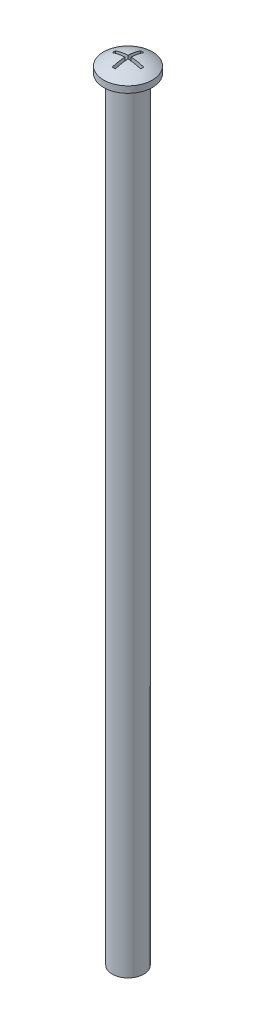
ISO-10303-21;
HEADER;
FILE_DESCRIPTION(('STEP AP214'),'2;1');
FILE_NAME('part.step','',(''),(''),'','','');
FILE_SCHEMA(('AUTOMOTIVE_DESIGN { 1 0 10303 214 1 1 1 1 }'));
ENDSEC;
DATA;
#1=APPLICATION_CONTEXT('core data for automotive mechanical design processes');
#2=APPLICATION_PROTOCOL_DEFINITION('international standard','automotive_design',2000,#1);
#3=PRODUCT_CONTEXT('',#1,'mechanical');
#4=PRODUCT('Part','Part','',(#3));
#5=PRODUCT_RELATED_PRODUCT_CATEGORY('part','',(#4));
#6=PRODUCT_DEFINITION_FORMATION('','',#4);
#7=PRODUCT_DEFINITION_CONTEXT('part definition',#1,'design');
#8=PRODUCT_DEFINITION('design','',#6,#7);
#9=PRODUCT_DEFINITION_SHAPE('','',#8);
#10=(LENGTH_UNIT() NAMED_UNIT(*) SI_UNIT(.MILLI.,.METRE.));
#11=(NAMED_UNIT(*) PLANE_ANGLE_UNIT() SI_UNIT($,.RADIAN.));
#12=(NAMED_UNIT(*) SI_UNIT($,.STERADIAN.) SOLID_ANGLE_UNIT());
#13=UNCERTAINTY_MEASURE_WITH_UNIT(LENGTH_MEASURE(1.E-05),#10,'distance_accuracy_value','');
#14=(GEOMETRIC_REPRESENTATION_CONTEXT(3) GLOBAL_UNCERTAINTY_ASSIGNED_CONTEXT((#13)) GLOBAL_UNIT_ASSIGNED_CONTEXT((#10,
#11,#12)) REPRESENTATION_CONTEXT('',''));
#15=CARTESIAN_POINT('',(0.,0.,0.));
#16=DIRECTION('',(0.,0.,1.));
#17=DIRECTION('',(1.,0.,0.));
#18=AXIS2_PLACEMENT_3D('',#15,#16,#17);
#19=CARTESIAN_POINT('',(0.,35.8974187788306,0.));
#20=CARTESIAN_POINT('',(-0.86080008171223,35.8959880970202,0.));
#21=CARTESIAN_POINT('',(-1.55,35.4115299673482,0.));
#22=B_SPLINE_CURVE_WITH_KNOTS('',2,(#19,#20,#21),.UNSPECIFIED.,.F.,.F.,(3,3),(0.,1.),.UNSPECIFIED.);
#23=CARTESIAN_POINT('',(0.,0.,0.));
#24=DIRECTION('',(0.,-1.,0.));
#25=AXIS1_PLACEMENT('',#23,#24);
#26=SURFACE_OF_REVOLUTION('',#22,#25);
#27=CARTESIAN_POINT('',(-0.1,35.7460206438407,-0.9));
#28=CARTESIAN_POINT('',(-0.0666666666666666,35.7473207457581,-0.9));
#29=CARTESIAN_POINT('',(-0.0333333333333332,35.7479707967168,-0.9));
#30=CARTESIAN_POINT('',(0.0333333333333336,35.7479707967168,-0.9));
#31=CARTESIAN_POINT('',(0.066666666666667,35.7473207457581,-0.9));
#32=CARTESIAN_POINT('',(0.1,35.7460206438407,-0.9));
#33=B_SPLINE_CURVE_WITH_KNOTS('',3,(#27,#28,#29,#30,#31,#32),.UNSPECIFIED.,.F.,.F.,(4,2,4),(0.,
0.100019013673602,0.200038027347205),.UNSPECIFIED.);
#34=CARTESIAN_POINT('',(-0.1,35.7460206438406,-0.9));
#35=VERTEX_POINT('',#34);
#36=CARTESIAN_POINT('',(0.1,35.7460206438406,-0.9));
#37=VERTEX_POINT('',#36);
#38=EDGE_CURVE('E53',#35,#37,#33,.T.);
#39=ORIENTED_EDGE('',*,*,#38,.T.);
#40=CARTESIAN_POINT('',(0.1,35.7460206438407,-0.9));
#41=CARTESIAN_POINT('',(0.1,35.7603650964249,-0.859165155971421));
#42=CARTESIAN_POINT('',(0.1,35.7736707218079,-0.817975380802403));
#43=CARTESIAN_POINT('',(0.1,35.7981960042845,-0.734980187538004));
#44=CARTESIAN_POINT('',(0.1,35.8094157043373,-0.693174782140508));
#45=CARTESIAN_POINT('',(0.0999999999999999,35.8397819917709,-0.567603593500357));
#46=CARTESIAN_POINT('',(0.0999999999999997,35.8558504893188,-0.483068742429389));
#47=CARTESIAN_POINT('',(0.0999999999999998,35.8748623212978,-0.348710392706932));
#48=CARTESIAN_POINT('',(0.0999999999999999,35.8804835266519,-0.299240524949403));
#49=CARTESIAN_POINT('',(0.1,35.8891250606415,-0.199864425522463));
#50=CARTESIAN_POINT('',(0.1,35.8921343946752,-0.149957234000707));
#51=CARTESIAN_POINT('',(0.1,35.893867884993,-0.0999999999999991));
#52=B_SPLINE_CURVE_WITH_KNOTS('',3,(#40,#41,#42,#43,#44,#45,#46,#47,#48,#49,#50,#51),
.UNSPECIFIED.,.F.,.F.,(4,2,2,2,2,4),(0.,0.129810934123178,0.259619194528052,0.517292623754669,
0.666598222884649,0.816529313343596),.UNSPECIFIED.);
#53=CARTESIAN_POINT('',(0.1,35.893867884993,-0.0999999999999998));
#54=VERTEX_POINT('',#53);
#55=EDGE_CURVE('E11',#37,#54,#52,.T.);
#56=ORIENTED_EDGE('',*,*,#55,.T.);
#57=CARTESIAN_POINT('',(0.0999999999999999,35.893867884993,-0.0999999999999998));
#58=CARTESIAN_POINT('',(0.109355285379155,35.8935439200009,-0.0999999999999997));
#59=CARTESIAN_POINT('',(0.118709056510519,35.8931750152553,-0.0999999999999997));
#60=CARTESIAN_POINT('',(0.165474926146777,35.8911041724258,-0.0999999999999997));
#61=CARTESIAN_POINT('',(0.202858048316559,35.8887239050631,-0.0999999999999997));
#62=CARTESIAN_POINT('',(0.315133594740093,35.8793365965761,-0.0999999999999998));
#63=CARTESIAN_POINT('',(0.389851384662339,35.8700842731403,-0.0999999999999998));
#64=CARTESIAN_POINT('',(0.53827131499717,35.8453396870849,-0.0999999999999997));
#65=CARTESIAN_POINT('',(0.611973271314862,35.8298463084133,-0.0999999999999997));
#66=CARTESIAN_POINT('',(0.721170542553564,35.8018911789562,-0.0999999999999997));
#67=CARTESIAN_POINT('',(0.757287143973613,35.7918067846708,-0.0999999999999997));
#68=CARTESIAN_POINT('',(0.82902501472042,35.7700803412918,-0.0999999999999998));
#69=CARTESIAN_POINT('',(0.864646568163323,35.7584392301397,-0.0999999999999998));
#70=CARTESIAN_POINT('',(0.899999999999999,35.7460206438406,-0.0999999999999998));
#71=B_SPLINE_CURVE_WITH_KNOTS('',3,(#57,#58,#59,#60,#61,#62,#63,#64,#65,#66,#67,#68,#69,#70),
.UNSPECIFIED.,.F.,.F.,(4,2,2,2,2,2,4),(0.,0.0280827228415932,0.140433640862802,
0.366035371056075,0.59167746222928,0.704140234262215,0.816535548819868),.UNSPECIFIED.);
#72=CARTESIAN_POINT('',(0.9,35.7460206438407,-0.0999999999999997));
#73=VERTEX_POINT('',#72);
#74=EDGE_CURVE('E135',#54,#73,#71,.T.);
#75=ORIENTED_EDGE('',*,*,#74,.T.);
#76=CARTESIAN_POINT('',(0.9,35.7460206438407,-0.0999999999999997));
#77=CARTESIAN_POINT('',(0.9,35.7473207457581,-0.0666666666666663));
#78=CARTESIAN_POINT('',(0.9,35.7479707967168,-0.033333333333333));
#79=CARTESIAN_POINT('',(0.9,35.7479707967168,0.0333333333333336));
#80=CARTESIAN_POINT('',(0.9,35.7473207457581,0.0666666666666669));
#81=CARTESIAN_POINT('',(0.9,35.7460206438406,0.1));
#82=B_SPLINE_CURVE_WITH_KNOTS('',3,(#76,#77,#78,#79,#80,#81),.UNSPECIFIED.,.F.,.F.,(4,2,4),(0.,
0.100019013673602,0.200038027347204),.UNSPECIFIED.);
#83=CARTESIAN_POINT('',(0.9,35.7460206438406,0.1));
#84=VERTEX_POINT('',#83);
#85=EDGE_CURVE('E224',#73,#84,#82,.T.);
#86=ORIENTED_EDGE('',*,*,#85,.T.);
#87=CARTESIAN_POINT('',(0.9,35.7460206438406,0.1));
#88=CARTESIAN_POINT('',(0.859165155971422,35.7603650964249,0.1));
#89=CARTESIAN_POINT('',(0.817975380802403,35.7736707218079,0.1));
#90=CARTESIAN_POINT('',(0.734980187538005,35.7981960042845,0.1));
#91=CARTESIAN_POINT('',(0.693174782140509,35.8094157043373,0.1));
#92=CARTESIAN_POINT('',(0.567603593500359,35.8397819917709,0.1));
#93=CARTESIAN_POINT('',(0.483068742429389,35.8558504893188,0.1));
#94=CARTESIAN_POINT('',(0.348710392706932,35.8748623212978,0.1));
#95=CARTESIAN_POINT('',(0.299240524949403,35.8804835266519,0.1));
#96=CARTESIAN_POINT('',(0.199864425522463,35.8891250606415,0.1));
#97=CARTESIAN_POINT('',(0.149957234000707,35.8921343946752,0.1));
#98=CARTESIAN_POINT('',(0.0999999999999989,35.893867884993,0.1));
#99=B_SPLINE_CURVE_WITH_KNOTS('',3,(#87,#88,#89,#90,#91,#92,#93,#94,#95,#96,#97,#98),
.UNSPECIFIED.,.F.,.F.,(4,2,2,2,2,4),(0.,0.12981093412318,0.259619194528053,0.51729262375467,
0.66659822288465,0.816529313343598),.UNSPECIFIED.);
#100=CARTESIAN_POINT('',(0.1,35.893867884993,0.1));
#101=VERTEX_POINT('',#100);
#102=EDGE_CURVE('E355',#84,#101,#99,.T.);
#103=ORIENTED_EDGE('',*,*,#102,.T.);
#104=CARTESIAN_POINT('',(0.0999999999999999,35.893867884993,0.1));
#105=CARTESIAN_POINT('',(0.1,35.8935439200009,0.109355285379155));
#106=CARTESIAN_POINT('',(0.1,35.8931750152553,0.118709056510519));
#107=CARTESIAN_POINT('',(0.1,35.8911041724257,0.165474926146776));
#108=CARTESIAN_POINT('',(0.1,35.8887239050631,0.20285804831656));
#109=CARTESIAN_POINT('',(0.0999999999999999,35.8793365965762,0.315133594740094));
#110=CARTESIAN_POINT('',(0.0999999999999999,35.8700842731403,0.389851384662338));
#111=CARTESIAN_POINT('',(0.1,35.8453396870849,0.538271314997169));
#112=CARTESIAN_POINT('',(0.1,35.8298463084133,0.611973271314862));
#113=CARTESIAN_POINT('',(0.0999999999999999,35.8018911789562,0.721170542553566));
#114=CARTESIAN_POINT('',(0.0999999999999999,35.7918067846708,0.757287143973614));
#115=CARTESIAN_POINT('',(0.1,35.7700803412918,0.829025014720422));
#116=CARTESIAN_POINT('',(0.1,35.7584392301397,0.864646568163323));
#117=CARTESIAN_POINT('',(0.1,35.7460206438406,0.899999999999999));
#118=B_SPLINE_CURVE_WITH_KNOTS('',3,(#104,#105,#106,#107,#108,#109,#110,#111,#112,#113,#114,
#115,#116,#117),.UNSPECIFIED.,.F.,.F.,(4,2,2,2,2,2,4),(0.,0.0280827228415933,0.140433640862801,
0.366035371056074,0.591677462229281,0.704140234262217,0.816535548819868),.UNSPECIFIED.);
#119=CARTESIAN_POINT('',(0.1,35.7460206438407,0.9));
#120=VERTEX_POINT('',#119);
#121=EDGE_CURVE('E349',#101,#120,#118,.T.);
#122=ORIENTED_EDGE('',*,*,#121,.T.);
#123=CARTESIAN_POINT('',(0.0999999999999999,35.7460206438407,0.9));
#124=CARTESIAN_POINT('',(0.0666666666666665,35.7473207457581,0.9));
#125=CARTESIAN_POINT('',(0.0333333333333332,35.7479707967168,0.9));
#126=CARTESIAN_POINT('',(-0.0333333333333335,35.7479707967168,0.9));
#127=CARTESIAN_POINT('',(-0.0666666666666668,35.7473207457581,0.9));
#128=CARTESIAN_POINT('',(-0.1,35.7460206438406,0.9));
#129=B_SPLINE_CURVE_WITH_KNOTS('',3,(#123,#124,#125,#126,#127,#128),.UNSPECIFIED.,.F.,.F.,(4,2,
4),(0.,0.100019013673602,0.200038027347204),.UNSPECIFIED.);
#130=CARTESIAN_POINT('',(-0.1,35.7460206438406,0.9));
#131=VERTEX_POINT('',#130);
#132=EDGE_CURVE('E342',#120,#131,#129,.T.);
#133=ORIENTED_EDGE('',*,*,#132,.T.);
#134=CARTESIAN_POINT('',(-0.1,35.7460206438406,0.9));
#135=CARTESIAN_POINT('',(-0.1,35.7603650964249,0.859165155971423));
#136=CARTESIAN_POINT('',(-0.1,35.7736707218079,0.817975380802407));
#137=CARTESIAN_POINT('',(-0.1,35.7981960042845,0.734980187538016));
#138=CARTESIAN_POINT('',(-0.1,35.8094157043373,0.693174782140524));
#139=CARTESIAN_POINT('',(-0.1,35.8397819917709,0.567603593500385));
#140=CARTESIAN_POINT('',(-0.1,35.8558504893188,0.483068742429421));
#141=CARTESIAN_POINT('',(-0.1,35.8748623212978,0.348710392706963));
#142=CARTESIAN_POINT('',(-0.1,35.8804835266519,0.299240524949429));
#143=CARTESIAN_POINT('',(-0.1,35.8891250606415,0.199864425522478));
#144=CARTESIAN_POINT('',(-0.1,35.8921343946752,0.149957234000716));
#145=CARTESIAN_POINT('',(-0.1,35.893867884993,0.100000000000003));
#146=B_SPLINE_CURVE_WITH_KNOTS('',3,(#134,#135,#136,#137,#138,#139,#140,#141,#142,#143,#144,
#145),.UNSPECIFIED.,.F.,.F.,(4,2,2,2,2,4),(0.,0.129810934123171,0.259619194528035,
0.517292623754634,0.66659822288463,0.816529313343594),.UNSPECIFIED.);
#147=CARTESIAN_POINT('',(-0.1,35.893867884993,0.1));
#148=VERTEX_POINT('',#147);
#149=EDGE_CURVE('E319',#131,#148,#146,.T.);
#150=ORIENTED_EDGE('',*,*,#149,.T.);
#151=CARTESIAN_POINT('',(-0.1,35.893867884993,0.1));
#152=CARTESIAN_POINT('',(-0.109355285379155,35.8935439200009,0.1));
#153=CARTESIAN_POINT('',(-0.118709056510518,35.8931750152552,0.1));
#154=CARTESIAN_POINT('',(-0.165474926146776,35.8911041724257,0.1));
#155=CARTESIAN_POINT('',(-0.202858048316559,35.8887239050631,0.1));
#156=CARTESIAN_POINT('',(-0.315133594740094,35.8793365965762,0.1));
#157=CARTESIAN_POINT('',(-0.389851384662337,35.8700842731403,0.1));
#158=CARTESIAN_POINT('',(-0.538271314997168,35.8453396870849,0.1));
#159=CARTESIAN_POINT('',(-0.611973271314863,35.8298463084133,0.100000000000001));
#160=CARTESIAN_POINT('',(-0.721170542553566,35.8018911789562,0.1));
#161=CARTESIAN_POINT('',(-0.757287143973615,35.7918067846708,0.1));
#162=CARTESIAN_POINT('',(-0.829025014720422,35.7700803412918,0.1));
#163=CARTESIAN_POINT('',(-0.864646568163323,35.7584392301396,0.1));
#164=CARTESIAN_POINT('',(-0.900000000000001,35.7460206438406,0.100000000000001));
#165=B_SPLINE_CURVE_WITH_KNOTS('',3,(#151,#152,#153,#154,#155,#156,#157,#158,#159,#160,#161,
#162,#163,#164),.UNSPECIFIED.,.F.,.F.,(4,2,2,2,2,2,4),(0.,0.0280827228415936,0.140433640862802,
0.366035371056073,0.591677462229281,0.70414023426222,0.816535548819869),.UNSPECIFIED.);
#166=CARTESIAN_POINT('',(-0.9,35.7460206438406,0.1));
#167=VERTEX_POINT('',#166);
#168=EDGE_CURVE('E312',#148,#167,#165,.T.);
#169=ORIENTED_EDGE('',*,*,#168,.T.);
#170=CARTESIAN_POINT('',(-0.9,35.7460206438406,0.1));
#171=CARTESIAN_POINT('',(-0.9,35.7473207457581,0.066666666666667));
#172=CARTESIAN_POINT('',(-0.9,35.7479707967168,0.0333333333333336));
#173=CARTESIAN_POINT('',(-0.9,35.7479707967168,-0.0333333333333333));
#174=CARTESIAN_POINT('',(-0.9,35.7473207457581,-0.0666666666666667));
#175=CARTESIAN_POINT('',(-0.9,35.7460206438407,-0.1));
#176=B_SPLINE_CURVE_WITH_KNOTS('',3,(#170,#171,#172,#173,#174,#175),.UNSPECIFIED.,.F.,.F.,(4,2,
4),(0.,0.100019013673602,0.200038027347205),.UNSPECIFIED.);
#177=CARTESIAN_POINT('',(-0.9,35.7460206438406,-0.0999999999999998));
#178=VERTEX_POINT('',#177);
#179=EDGE_CURVE('E305',#167,#178,#176,.T.);
#180=ORIENTED_EDGE('',*,*,#179,.T.);
#181=CARTESIAN_POINT('',(-0.9,35.7460206438406,-0.0999999999999999));
#182=CARTESIAN_POINT('',(-0.859165155971419,35.7603650964249,-0.0999999999999998));
#183=CARTESIAN_POINT('',(-0.8179753808024,35.7736707218079,-0.0999999999999998));
#184=CARTESIAN_POINT('',(-0.734980187538004,35.7981960042845,-0.0999999999999998));
#185=CARTESIAN_POINT('',(-0.693174782140509,35.8094157043373,-0.0999999999999998));
#186=CARTESIAN_POINT('',(-0.567603593500361,35.8397819917709,-0.0999999999999998));
#187=CARTESIAN_POINT('',(-0.48306874242939,35.8558504893188,-0.0999999999999997));
#188=CARTESIAN_POINT('',(-0.348710392706932,35.8748623212978,-0.0999999999999997));
#189=CARTESIAN_POINT('',(-0.299240524949403,35.8804835266519,-0.0999999999999998));
#190=CARTESIAN_POINT('',(-0.199864425522464,35.8891250606415,-0.0999999999999998));
#191=CARTESIAN_POINT('',(-0.149957234000707,35.8921343946752,-0.0999999999999999));
#192=CARTESIAN_POINT('',(-0.0999999999999993,35.893867884993,-0.0999999999999998));
#193=B_SPLINE_CURVE_WITH_KNOTS('',3,(#181,#182,#183,#184,#185,#186,#187,#188,#189,#190,#191,
#192),.UNSPECIFIED.,.F.,.F.,(4,2,2,2,2,4),(0.,0.12981093412318,0.259619194528054,
0.517292623754671,0.666598222884651,0.816529313343598),.UNSPECIFIED.);
#194=CARTESIAN_POINT('',(-0.1,35.893867884993,-0.0999999999999998));
#195=VERTEX_POINT('',#194);
#196=EDGE_CURVE('E271',#178,#195,#193,.T.);
#197=ORIENTED_EDGE('',*,*,#196,.T.);
#198=CARTESIAN_POINT('',(-0.1,35.893867884993,-0.0999999999999998));
#199=CARTESIAN_POINT('',(-0.1,35.8935439200009,-0.109355285379155));
#200=CARTESIAN_POINT('',(-0.1,35.8931750152553,-0.118709056510518));
#201=CARTESIAN_POINT('',(-0.1,35.8911041724258,-0.165474926146776));
#202=CARTESIAN_POINT('',(-0.1,35.8887239050631,-0.202858048316559));
#203=CARTESIAN_POINT('',(-0.1,35.8793365965761,-0.315133594740092));
#204=CARTESIAN_POINT('',(-0.1,35.8700842731403,-0.389851384662336));
#205=CARTESIAN_POINT('',(-0.1,35.8453396870849,-0.538271314997168));
#206=CARTESIAN_POINT('',(-0.1,35.8298463084133,-0.611973271314863));
#207=CARTESIAN_POINT('',(-0.1,35.8018911789562,-0.721170542553564));
#208=CARTESIAN_POINT('',(-0.1,35.7918067846708,-0.757287143973612));
#209=CARTESIAN_POINT('',(-0.1,35.7700803412918,-0.829025014720419));
#210=CARTESIAN_POINT('',(-0.1,35.7584392301396,-0.864646568163322));
#211=CARTESIAN_POINT('',(-0.1,35.7460206438406,-0.9));
#212=B_SPLINE_CURVE_WITH_KNOTS('',3,(#198,#199,#200,#201,#202,#203,#204,#205,#206,#207,#208,
#209,#210,#211),.UNSPECIFIED.,.F.,.F.,(4,2,2,2,2,2,4),(0.,0.028082722841593,0.140433640862802,
0.366035371056074,0.591677462229278,0.704140234262214,0.816535548819869),.UNSPECIFIED.);
#213=EDGE_CURVE('E268',#195,#35,#212,.T.);
#214=ORIENTED_EDGE('',*,*,#213,.T.);
#215=EDGE_LOOP('',(#39,#56,#75,#86,#103,#122,#133,#150,#169,#180,#197,#214));
#216=FACE_BOUND('',#215,.T.);
#217=CARTESIAN_POINT('',(0.,35.4115299673482,0.));
#218=DIRECTION('',(0.,-1.,0.));
#219=DIRECTION('',(0.,0.,-1.));
#220=AXIS2_PLACEMENT_3D('',#217,#218,#219);
#221=CIRCLE('',#220,1.55);
#222=CARTESIAN_POINT('',(0.,35.4115299673482,-1.55));
#223=VERTEX_POINT('',#222);
#224=EDGE_CURVE('E215',#223,#223,#221,.T.);
#225=ORIENTED_EDGE('',*,*,#224,.F.);
#226=EDGE_LOOP('',(#225));
#227=FACE_BOUND('',#226,.T.);
#228=ADVANCED_FACE('F39',(#216,#227),#26,.T.);
#229=CARTESIAN_POINT('',(0.,0.,0.));
#230=DIRECTION('',(0.,-1.,0.));
#231=DIRECTION('',(0.,0.,-1.));
#232=AXIS2_PLACEMENT_3D('',#229,#230,#231);
#233=CYLINDRICAL_SURFACE('',#232,1.55);
#234=CARTESIAN_POINT('',(0.,35.,0.));
#235=DIRECTION('',(0.,-1.,0.));
#236=DIRECTION('',(0.,0.,-1.));
#237=AXIS2_PLACEMENT_3D('',#234,#235,#236);
#238=CIRCLE('',#237,1.55);
#239=CARTESIAN_POINT('',(0.,35.,-1.55));
#240=VERTEX_POINT('',#239);
#241=EDGE_CURVE('E212',#240,#240,#238,.T.);
#242=ORIENTED_EDGE('',*,*,#241,.F.);
#243=EDGE_LOOP('',(#242));
#244=FACE_BOUND('',#243,.T.);
#245=ORIENTED_EDGE('',*,*,#224,.T.);
#246=EDGE_LOOP('',(#245));
#247=FACE_BOUND('',#246,.T.);
#248=ADVANCED_FACE('F250',(#244,#247),#233,.T.);
#249=CARTESIAN_POINT('',(-1.,35.,0.));
#250=DIRECTION('',(0.,1.,0.));
#251=DIRECTION('',(0.,0.,1.));
#252=AXIS2_PLACEMENT_3D('',#249,#250,#251);
#253=PLANE('',#252);
#254=CARTESIAN_POINT('',(0.,35.,0.));
#255=DIRECTION('',(0.,-1.,0.));
#256=DIRECTION('',(0.,0.,-1.));
#257=AXIS2_PLACEMENT_3D('',#254,#255,#256);
#258=CIRCLE('',#257,1.);
#259=CARTESIAN_POINT('',(0.,35.,-1.));
#260=VERTEX_POINT('',#259);
#261=EDGE_CURVE('E209',#260,#260,#258,.T.);
#262=ORIENTED_EDGE('',*,*,#261,.F.);
#263=EDGE_LOOP('',(#262));
#264=FACE_BOUND('',#263,.T.);
#265=ORIENTED_EDGE('',*,*,#241,.T.);
#266=EDGE_LOOP('',(#265));
#267=FACE_BOUND('',#266,.T.);
#268=ADVANCED_FACE('F247',(#264,#267),#253,.F.);
#269=CARTESIAN_POINT('',(0.,0.,0.));
#270=DIRECTION('',(0.,-1.,0.));
#271=DIRECTION('',(0.,0.,-1.));
#272=AXIS2_PLACEMENT_3D('',#269,#270,#271);
#273=CYLINDRICAL_SURFACE('',#272,1.);
#274=CARTESIAN_POINT('',(0.,-14.000000000005,0.));
#275=DIRECTION('',(0.,-1.,0.));
#276=DIRECTION('',(0.,0.,-1.));
#277=AXIS2_PLACEMENT_3D('',#274,#275,#276);
#278=CIRCLE('',#277,1.);
#279=CARTESIAN_POINT('',(0.,-14.000000000005,-1.));
#280=VERTEX_POINT('',#279);
#281=EDGE_CURVE('E181',#280,#280,#278,.T.);
#282=ORIENTED_EDGE('',*,*,#281,.F.);
#283=EDGE_LOOP('',(#282));
#284=FACE_BOUND('',#283,.T.);
#285=ORIENTED_EDGE('',*,*,#261,.T.);
#286=EDGE_LOOP('',(#285));
#287=FACE_BOUND('',#286,.T.);
#288=ADVANCED_FACE('F243',(#284,#287),#273,.T.);
#289=CARTESIAN_POINT('',(0.,-14.000000000005,0.));
#290=DIRECTION('',(0.,1.,0.));
#291=DIRECTION('',(0.,0.,1.));
#292=AXIS2_PLACEMENT_3D('',#289,#290,#291);
#293=PLANE('',#292);
#294=ORIENTED_EDGE('',*,*,#281,.T.);
#295=EDGE_LOOP('',(#294));
#296=FACE_BOUND('',#295,.T.);
#297=ADVANCED_FACE('F240',(#296),#293,.F.);
#298=CARTESIAN_POINT('',(0.1,45.4115299673482,-0.0999999999999998));
#299=DIRECTION('',(1.,0.,0.));
#300=DIRECTION('',(0.,0.,-1.));
#301=AXIS2_PLACEMENT_3D('',#298,#299,#300);
#302=PLANE('',#301);
#303=DIRECTION('',(0.,-1.,0.));
#304=VECTOR('',#303,1.);
#305=CARTESIAN_POINT('',(0.1,45.4115299673482,-0.9));
#306=LINE('',#305,#304);
#307=CARTESIAN_POINT('',(0.1,35.4115299673482,-0.9));
#308=VERTEX_POINT('',#307);
#309=EDGE_CURVE('E151',#37,#308,#306,.T.);
#310=ORIENTED_EDGE('',*,*,#309,.T.);
#311=DIRECTION('',(0.,0.,1.));
#312=VECTOR('',#311,1.);
#313=CARTESIAN_POINT('',(0.1,35.4115299673482,-0.0999999999999998));
#314=LINE('',#313,#312);
#315=CARTESIAN_POINT('',(0.1,35.4115299673482,-0.0999999999999998));
#316=VERTEX_POINT('',#315);
#317=EDGE_CURVE('E144',#308,#316,#314,.T.);
#318=ORIENTED_EDGE('',*,*,#317,.T.);
#319=DIRECTION('',(0.,-1.,0.));
#320=VECTOR('',#319,1.);
#321=CARTESIAN_POINT('',(0.1,45.4115299673482,-0.0999999999999998));
#322=LINE('',#321,#320);
#323=EDGE_CURVE('E130',#54,#316,#322,.T.);
#324=ORIENTED_EDGE('',*,*,#323,.F.);
#325=ORIENTED_EDGE('',*,*,#55,.F.);
#326=EDGE_LOOP('',(#310,#318,#324,#325));
#327=FACE_BOUND('',#326,.T.);
#328=ADVANCED_FACE('F150',(#327),#302,.F.);
#329=CARTESIAN_POINT('',(-0.0999999999999999,45.4115299673482,-0.9));
#330=DIRECTION('',(0.,0.,-1.));
#331=DIRECTION('',(-1.,0.,0.));
#332=AXIS2_PLACEMENT_3D('',#329,#330,#331);
#333=PLANE('',#332);
#334=DIRECTION('',(0.,-1.,0.));
#335=VECTOR('',#334,1.);
#336=CARTESIAN_POINT('',(-0.0999999999999999,45.4115299673482,-0.9));
#337=LINE('',#336,#335);
#338=CARTESIAN_POINT('',(-0.1,35.4115299673482,-0.9));
#339=VERTEX_POINT('',#338);
#340=EDGE_CURVE('E182',#35,#339,#337,.T.);
#341=ORIENTED_EDGE('',*,*,#340,.T.);
#342=DIRECTION('',(1.,0.,0.));
#343=VECTOR('',#342,1.);
#344=CARTESIAN_POINT('',(-0.1,35.4115299673482,-0.9));
#345=LINE('',#344,#343);
#346=EDGE_CURVE('E137',#339,#308,#345,.T.);
#347=ORIENTED_EDGE('',*,*,#346,.T.);
#348=ORIENTED_EDGE('',*,*,#309,.F.);
#349=ORIENTED_EDGE('',*,*,#38,.F.);
#350=EDGE_LOOP('',(#341,#347,#348,#349));
#351=FACE_BOUND('',#350,.T.);
#352=ADVANCED_FACE('F239',(#351),#333,.F.);
#353=CARTESIAN_POINT('',(-0.0999999999999999,45.4115299673482,-0.0999999999999998));
#354=DIRECTION('',(-1.,0.,0.));
#355=DIRECTION('',(0.,-1.,0.));
#356=AXIS2_PLACEMENT_3D('',#353,#354,#355);
#357=PLANE('',#356);
#358=DIRECTION('',(0.,-1.,0.));
#359=VECTOR('',#358,1.);
#360=CARTESIAN_POINT('',(-0.0999999999999999,45.4115299673482,-0.0999999999999998));
#361=LINE('',#360,#359);
#362=CARTESIAN_POINT('',(-0.1,35.4115299673482,-0.0999999999999998));
#363=VERTEX_POINT('',#362);
#364=EDGE_CURVE('E184',#195,#363,#361,.T.);
#365=ORIENTED_EDGE('',*,*,#364,.T.);
#366=DIRECTION('',(0.,0.,-1.));
#367=VECTOR('',#366,1.);
#368=CARTESIAN_POINT('',(-0.1,35.4115299673482,-0.0999999999999998));
#369=LINE('',#368,#367);
#370=EDGE_CURVE('E176',#363,#339,#369,.T.);
#371=ORIENTED_EDGE('',*,*,#370,.T.);
#372=ORIENTED_EDGE('',*,*,#340,.F.);
#373=ORIENTED_EDGE('',*,*,#213,.F.);
#374=EDGE_LOOP('',(#365,#371,#372,#373));
#375=FACE_BOUND('',#374,.T.);
#376=ADVANCED_FACE('F287',(#375),#357,.F.);
#377=CARTESIAN_POINT('',(-0.0999999999999999,45.4115299673482,-0.0999999999999998));
#378=DIRECTION('',(0.,0.,-1.));
#379=DIRECTION('',(-1.,0.,0.));
#380=AXIS2_PLACEMENT_3D('',#377,#378,#379);
#381=PLANE('',#380);
#382=DIRECTION('',(0.,-1.,0.));
#383=VECTOR('',#382,1.);
#384=CARTESIAN_POINT('',(-0.9,45.4115299673482,-0.0999999999999998));
#385=LINE('',#384,#383);
#386=CARTESIAN_POINT('',(-0.9,35.4115299673482,-0.0999999999999998));
#387=VERTEX_POINT('',#386);
#388=EDGE_CURVE('E186',#178,#387,#385,.T.);
#389=ORIENTED_EDGE('',*,*,#388,.T.);
#390=DIRECTION('',(1.,0.,0.));
#391=VECTOR('',#390,1.);
#392=CARTESIAN_POINT('',(-0.1,35.4115299673482,-0.0999999999999998));
#393=LINE('',#392,#391);
#394=EDGE_CURVE('E173',#387,#363,#393,.T.);
#395=ORIENTED_EDGE('',*,*,#394,.T.);
#396=ORIENTED_EDGE('',*,*,#364,.F.);
#397=ORIENTED_EDGE('',*,*,#196,.F.);
#398=EDGE_LOOP('',(#389,#395,#396,#397));
#399=FACE_BOUND('',#398,.T.);
#400=ADVANCED_FACE('F291',(#399),#381,.F.);
#401=CARTESIAN_POINT('',(-0.9,45.4115299673482,0.1));
#402=DIRECTION('',(-1.,0.,0.));
#403=DIRECTION('',(0.,-1.,0.));
#404=AXIS2_PLACEMENT_3D('',#401,#402,#403);
#405=PLANE('',#404);
#406=DIRECTION('',(0.,-1.,0.));
#407=VECTOR('',#406,1.);
#408=CARTESIAN_POINT('',(-0.9,45.4115299673482,0.1));
#409=LINE('',#408,#407);
#410=CARTESIAN_POINT('',(-0.9,35.4115299673482,0.1));
#411=VERTEX_POINT('',#410);
#412=EDGE_CURVE('E188',#167,#411,#409,.T.);
#413=ORIENTED_EDGE('',*,*,#412,.T.);
#414=DIRECTION('',(0.,0.,-1.));
#415=VECTOR('',#414,1.);
#416=CARTESIAN_POINT('',(-0.9,35.4115299673482,0.1));
#417=LINE('',#416,#415);
#418=EDGE_CURVE('E170',#411,#387,#417,.T.);
#419=ORIENTED_EDGE('',*,*,#418,.T.);
#420=ORIENTED_EDGE('',*,*,#388,.F.);
#421=ORIENTED_EDGE('',*,*,#179,.F.);
#422=EDGE_LOOP('',(#413,#419,#420,#421));
#423=FACE_BOUND('',#422,.T.);
#424=ADVANCED_FACE('F296',(#423),#405,.F.);
#425=CARTESIAN_POINT('',(-0.1,45.4115299673482,0.1));
#426=DIRECTION('',(0.,0.,1.));
#427=DIRECTION('',(1.,0.,0.));
#428=AXIS2_PLACEMENT_3D('',#425,#426,#427);
#429=PLANE('',#428);
#430=DIRECTION('',(0.,-1.,0.));
#431=VECTOR('',#430,1.);
#432=CARTESIAN_POINT('',(-0.1,45.4115299673482,0.1));
#433=LINE('',#432,#431);
#434=CARTESIAN_POINT('',(-0.1,35.4115299673482,0.1));
#435=VERTEX_POINT('',#434);
#436=EDGE_CURVE('E190',#148,#435,#433,.T.);
#437=ORIENTED_EDGE('',*,*,#436,.T.);
#438=DIRECTION('',(-1.,0.,0.));
#439=VECTOR('',#438,1.);
#440=CARTESIAN_POINT('',(-0.1,35.4115299673482,0.1));
#441=LINE('',#440,#439);
#442=EDGE_CURVE('E167',#435,#411,#441,.T.);
#443=ORIENTED_EDGE('',*,*,#442,.T.);
#444=ORIENTED_EDGE('',*,*,#412,.F.);
#445=ORIENTED_EDGE('',*,*,#168,.F.);
#446=EDGE_LOOP('',(#437,#443,#444,#445));
#447=FACE_BOUND('',#446,.T.);
#448=ADVANCED_FACE('F326',(#447),#429,.F.);
#449=CARTESIAN_POINT('',(-0.0999999999999999,45.4115299673482,0.9));
#450=DIRECTION('',(-1.,0.,0.));
#451=DIRECTION('',(0.,0.,1.));
#452=AXIS2_PLACEMENT_3D('',#449,#450,#451);
#453=PLANE('',#452);
#454=DIRECTION('',(0.,-1.,0.));
#455=VECTOR('',#454,1.);
#456=CARTESIAN_POINT('',(-0.0999999999999999,45.4115299673482,0.9));
#457=LINE('',#456,#455);
#458=CARTESIAN_POINT('',(-0.1,35.4115299673482,0.9));
#459=VERTEX_POINT('',#458);
#460=EDGE_CURVE('E192',#131,#459,#457,.T.);
#461=ORIENTED_EDGE('',*,*,#460,.T.);
#462=DIRECTION('',(0.,0.,-1.));
#463=VECTOR('',#462,1.);
#464=CARTESIAN_POINT('',(-0.1,35.4115299673482,0.9));
#465=LINE('',#464,#463);
#466=EDGE_CURVE('E164',#459,#435,#465,.T.);
#467=ORIENTED_EDGE('',*,*,#466,.T.);
#468=ORIENTED_EDGE('',*,*,#436,.F.);
#469=ORIENTED_EDGE('',*,*,#149,.F.);
#470=EDGE_LOOP('',(#461,#467,#468,#469));
#471=FACE_BOUND('',#470,.T.);
#472=ADVANCED_FACE('F329',(#471),#453,.F.);
#473=CARTESIAN_POINT('',(-0.0999999999999999,45.4115299673482,0.9));
#474=DIRECTION('',(0.,0.,1.));
#475=DIRECTION('',(1.,0.,0.));
#476=AXIS2_PLACEMENT_3D('',#473,#474,#475);
#477=PLANE('',#476);
#478=DIRECTION('',(0.,-1.,0.));
#479=VECTOR('',#478,1.);
#480=CARTESIAN_POINT('',(0.1,45.4115299673482,0.9));
#481=LINE('',#480,#479);
#482=CARTESIAN_POINT('',(0.1,35.4115299673482,0.9));
#483=VERTEX_POINT('',#482);
#484=EDGE_CURVE('E194',#120,#483,#481,.T.);
#485=ORIENTED_EDGE('',*,*,#484,.T.);
#486=DIRECTION('',(-1.,0.,0.));
#487=VECTOR('',#486,1.);
#488=CARTESIAN_POINT('',(-0.1,35.4115299673482,0.9));
#489=LINE('',#488,#487);
#490=EDGE_CURVE('E161',#483,#459,#489,.T.);
#491=ORIENTED_EDGE('',*,*,#490,.T.);
#492=ORIENTED_EDGE('',*,*,#460,.F.);
#493=ORIENTED_EDGE('',*,*,#132,.F.);
#494=EDGE_LOOP('',(#485,#491,#492,#493));
#495=FACE_BOUND('',#494,.T.);
#496=ADVANCED_FACE('F334',(#495),#477,.F.);
#497=CARTESIAN_POINT('',(0.1,45.4115299673482,0.9));
#498=DIRECTION('',(1.,0.,0.));
#499=DIRECTION('',(0.,0.,-1.));
#500=AXIS2_PLACEMENT_3D('',#497,#498,#499);
#501=PLANE('',#500);
#502=DIRECTION('',(0.,-1.,0.));
#503=VECTOR('',#502,1.);
#504=CARTESIAN_POINT('',(0.1,45.4115299673482,0.1));
#505=LINE('',#504,#503);
#506=CARTESIAN_POINT('',(0.1,35.4115299673482,0.1));
#507=VERTEX_POINT('',#506);
#508=EDGE_CURVE('E196',#101,#507,#505,.T.);
#509=ORIENTED_EDGE('',*,*,#508,.T.);
#510=DIRECTION('',(0.,0.,1.));
#511=VECTOR('',#510,1.);
#512=CARTESIAN_POINT('',(0.1,35.4115299673482,0.9));
#513=LINE('',#512,#511);
#514=EDGE_CURVE('E158',#507,#483,#513,.T.);
#515=ORIENTED_EDGE('',*,*,#514,.T.);
#516=ORIENTED_EDGE('',*,*,#484,.F.);
#517=ORIENTED_EDGE('',*,*,#121,.F.);
#518=EDGE_LOOP('',(#509,#515,#516,#517));
#519=FACE_BOUND('',#518,.T.);
#520=ADVANCED_FACE('F339',(#519),#501,.F.);
#521=CARTESIAN_POINT('',(0.9,45.4115299673482,0.1));
#522=DIRECTION('',(0.,0.,1.));
#523=DIRECTION('',(1.,0.,0.));
#524=AXIS2_PLACEMENT_3D('',#521,#522,#523);
#525=PLANE('',#524);
#526=DIRECTION('',(0.,-1.,0.));
#527=VECTOR('',#526,1.);
#528=CARTESIAN_POINT('',(0.9,45.4115299673482,0.1));
#529=LINE('',#528,#527);
#530=CARTESIAN_POINT('',(0.9,35.4115299673482,0.1));
#531=VERTEX_POINT('',#530);
#532=EDGE_CURVE('E198',#84,#531,#529,.T.);
#533=ORIENTED_EDGE('',*,*,#532,.T.);
#534=DIRECTION('',(-1.,0.,0.));
#535=VECTOR('',#534,1.);
#536=CARTESIAN_POINT('',(0.9,35.4115299673482,0.1));
#537=LINE('',#536,#535);
#538=EDGE_CURVE('E155',#531,#507,#537,.T.);
#539=ORIENTED_EDGE('',*,*,#538,.T.);
#540=ORIENTED_EDGE('',*,*,#508,.F.);
#541=ORIENTED_EDGE('',*,*,#102,.F.);
#542=EDGE_LOOP('',(#533,#539,#540,#541));
#543=FACE_BOUND('',#542,.T.);
#544=ADVANCED_FACE('F361',(#543),#525,.F.);
#545=CARTESIAN_POINT('',(0.9,45.4115299673482,0.1));
#546=DIRECTION('',(1.,0.,0.));
#547=DIRECTION('',(0.,1.,0.));
#548=AXIS2_PLACEMENT_3D('',#545,#546,#547);
#549=PLANE('',#548);
#550=DIRECTION('',(0.,-1.,0.));
#551=VECTOR('',#550,1.);
#552=CARTESIAN_POINT('',(0.9,45.4115299673482,-0.0999999999999998));
#553=LINE('',#552,#551);
#554=CARTESIAN_POINT('',(0.9,35.4115299673482,-0.0999999999999998));
#555=VERTEX_POINT('',#554);
#556=EDGE_CURVE('E60',#73,#555,#553,.T.);
#557=ORIENTED_EDGE('',*,*,#556,.T.);
#558=DIRECTION('',(0.,0.,1.));
#559=VECTOR('',#558,1.);
#560=CARTESIAN_POINT('',(0.9,35.4115299673482,0.1));
#561=LINE('',#560,#559);
#562=EDGE_CURVE('E148',#555,#531,#561,.T.);
#563=ORIENTED_EDGE('',*,*,#562,.T.);
#564=ORIENTED_EDGE('',*,*,#532,.F.);
#565=ORIENTED_EDGE('',*,*,#85,.F.);
#566=EDGE_LOOP('',(#557,#563,#564,#565));
#567=FACE_BOUND('',#566,.T.);
#568=ADVANCED_FACE('F233',(#567),#549,.F.);
#569=CARTESIAN_POINT('',(0.9,45.4115299673482,-0.0999999999999998));
#570=DIRECTION('',(0.,0.,-1.));
#571=DIRECTION('',(-1.,0.,0.));
#572=AXIS2_PLACEMENT_3D('',#569,#570,#571);
#573=PLANE('',#572);
#574=ORIENTED_EDGE('',*,*,#323,.T.);
#575=DIRECTION('',(1.,0.,0.));
#576=VECTOR('',#575,1.);
#577=CARTESIAN_POINT('',(0.9,35.4115299673482,-0.0999999999999998));
#578=LINE('',#577,#576);
#579=EDGE_CURVE('E133',#316,#555,#578,.T.);
#580=ORIENTED_EDGE('',*,*,#579,.T.);
#581=ORIENTED_EDGE('',*,*,#556,.F.);
#582=ORIENTED_EDGE('',*,*,#74,.F.);
#583=EDGE_LOOP('',(#574,#580,#581,#582));
#584=FACE_BOUND('',#583,.T.);
#585=ADVANCED_FACE('F132',(#584),#573,.F.);
#586=CARTESIAN_POINT('',(0.,35.4115299673482,0.));
#587=DIRECTION('',(0.,-1.,0.));
#588=DIRECTION('',(0.,0.,-1.));
#589=AXIS2_PLACEMENT_3D('',#586,#587,#588);
#590=PLANE('',#589);
#591=ORIENTED_EDGE('',*,*,#317,.F.);
#592=ORIENTED_EDGE('',*,*,#346,.F.);
#593=ORIENTED_EDGE('',*,*,#370,.F.);
#594=ORIENTED_EDGE('',*,*,#394,.F.);
#595=ORIENTED_EDGE('',*,*,#418,.F.);
#596=ORIENTED_EDGE('',*,*,#442,.F.);
#597=ORIENTED_EDGE('',*,*,#466,.F.);
#598=ORIENTED_EDGE('',*,*,#490,.F.);
#599=ORIENTED_EDGE('',*,*,#514,.F.);
#600=ORIENTED_EDGE('',*,*,#538,.F.);
#601=ORIENTED_EDGE('',*,*,#562,.F.);
#602=ORIENTED_EDGE('',*,*,#579,.F.);
#603=EDGE_LOOP('',(#591,#592,#593,#594,#595,#596,#597,#598,#599,#600,#601,#602));
#604=FACE_BOUND('',#603,.T.);
#605=ADVANCED_FACE('F142',(#604),#590,.F.);
#606=CLOSED_SHELL('',(#228,#248,#268,#288,#297,#328,#352,#376,#400,#424,#448,#472,#496,#520,
#544,#568,#585,#605));
#607=MANIFOLD_SOLID_BREP('B2',#606);
#608=ADVANCED_BREP_SHAPE_REPRESENTATION('',(#18,#607),#14);
#609=SHAPE_DEFINITION_REPRESENTATION(#9,#608);
ENDSEC;
END-ISO-10303-21;
